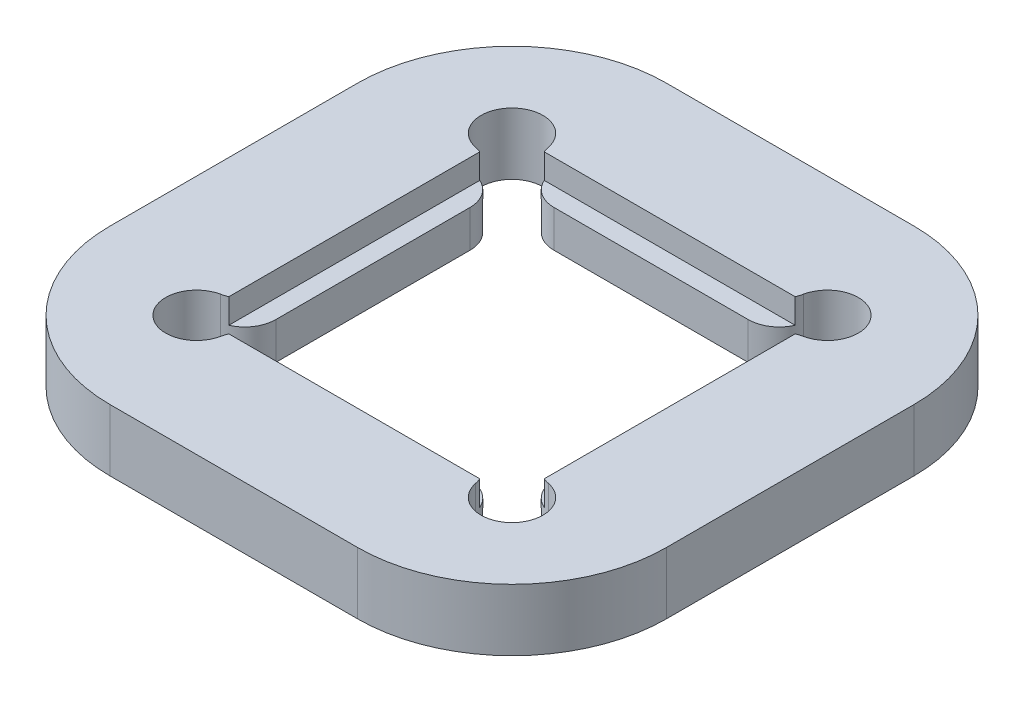
ISO-10303-21;
HEADER;
FILE_DESCRIPTION(('STEP AP214'),'2;1');
FILE_NAME('part.step','',(''),(''),'','','');
FILE_SCHEMA(('AUTOMOTIVE_DESIGN { 1 0 10303 214 1 1 1 1 }'));
ENDSEC;
DATA;
#1=APPLICATION_CONTEXT('core data for automotive mechanical design processes');
#2=APPLICATION_PROTOCOL_DEFINITION('international standard','automotive_design',2000,#1);
#3=PRODUCT_CONTEXT('',#1,'mechanical');
#4=PRODUCT('Part','Part','',(#3));
#5=PRODUCT_RELATED_PRODUCT_CATEGORY('part','',(#4));
#6=PRODUCT_DEFINITION_FORMATION('','',#4);
#7=PRODUCT_DEFINITION_CONTEXT('part definition',#1,'design');
#8=PRODUCT_DEFINITION('design','',#6,#7);
#9=PRODUCT_DEFINITION_SHAPE('','',#8);
#10=(LENGTH_UNIT() NAMED_UNIT(*) SI_UNIT(.MILLI.,.METRE.));
#11=(NAMED_UNIT(*) PLANE_ANGLE_UNIT() SI_UNIT($,.RADIAN.));
#12=(NAMED_UNIT(*) SI_UNIT($,.STERADIAN.) SOLID_ANGLE_UNIT());
#13=UNCERTAINTY_MEASURE_WITH_UNIT(LENGTH_MEASURE(1.E-05),#10,'distance_accuracy_value','');
#14=(GEOMETRIC_REPRESENTATION_CONTEXT(3) GLOBAL_UNCERTAINTY_ASSIGNED_CONTEXT((#13)) GLOBAL_UNIT_ASSIGNED_CONTEXT((#10,
#11,#12)) REPRESENTATION_CONTEXT('',''));
#15=CARTESIAN_POINT('',(0.,0.,0.));
#16=DIRECTION('',(0.,0.,1.));
#17=DIRECTION('',(1.,0.,0.));
#18=AXIS2_PLACEMENT_3D('',#15,#16,#17);
#19=CARTESIAN_POINT('',(0.,6.,0.));
#20=DIRECTION('',(0.,1.,0.));
#21=DIRECTION('',(0.,0.,1.));
#22=AXIS2_PLACEMENT_3D('',#19,#20,#21);
#23=PLANE('',#22);
#24=DIRECTION('',(-1.,0.,0.));
#25=VECTOR('',#24,1.);
#26=CARTESIAN_POINT('',(19.5,6.,-70.5));
#27=LINE('',#26,#25);
#28=CARTESIAN_POINT('',(65.2846167238231,6.,-70.5));
#29=VERTEX_POINT('',#28);
#30=CARTESIAN_POINT('',(24.7153832761769,6.,-70.5));
#31=VERTEX_POINT('',#30);
#32=EDGE_CURVE('E419',#29,#31,#27,.T.);
#33=ORIENTED_EDGE('',*,*,#32,.T.);
#34=CARTESIAN_POINT('',(29.2979589711327,6.,-72.5));
#35=DIRECTION('',(0.,1.,0.));
#36=DIRECTION('',(0.,0.,1.));
#37=AXIS2_PLACEMENT_3D('',#34,#35,#36);
#38=CIRCLE('',#37,5.);
#39=CARTESIAN_POINT('',(29.2979589711327,6.,-67.5));
#40=VERTEX_POINT('',#39);
#41=EDGE_CURVE('E319',#31,#40,#38,.T.);
#42=ORIENTED_EDGE('',*,*,#41,.T.);
#43=DIRECTION('',(-1.,0.,0.));
#44=VECTOR('',#43,1.);
#45=CARTESIAN_POINT('',(22.5,6.,-67.5));
#46=LINE('',#45,#44);
#47=CARTESIAN_POINT('',(60.7020410288673,6.,-67.5));
#48=VERTEX_POINT('',#47);
#49=EDGE_CURVE('E532',#48,#40,#46,.T.);
#50=ORIENTED_EDGE('',*,*,#49,.F.);
#51=CARTESIAN_POINT('',(60.7020410288673,6.,-72.5));
#52=DIRECTION('',(0.,1.,0.));
#53=DIRECTION('',(0.,0.,1.));
#54=AXIS2_PLACEMENT_3D('',#51,#52,#53);
#55=CIRCLE('',#54,5.);
#56=EDGE_CURVE('E271',#48,#29,#55,.T.);
#57=ORIENTED_EDGE('',*,*,#56,.T.);
#58=EDGE_LOOP('',(#33,#42,#50,#57));
#59=FACE_BOUND('',#58,.T.);
#60=ADVANCED_FACE('F33',(#59),#23,.T.);
#61=DIRECTION('',(1.,0.,0.));
#62=VECTOR('',#61,1.);
#63=CARTESIAN_POINT('',(22.5,6.,-22.5));
#64=LINE('',#63,#62);
#65=CARTESIAN_POINT('',(29.2979589711327,6.,-22.5));
#66=VERTEX_POINT('',#65);
#67=CARTESIAN_POINT('',(60.7020410288673,6.,-22.5));
#68=VERTEX_POINT('',#67);
#69=EDGE_CURVE('E527',#66,#68,#64,.T.);
#70=ORIENTED_EDGE('',*,*,#69,.F.);
#71=CARTESIAN_POINT('',(29.2979589711327,6.,-17.5));
#72=DIRECTION('',(0.,1.,0.));
#73=DIRECTION('',(0.,0.,1.));
#74=AXIS2_PLACEMENT_3D('',#71,#72,#73);
#75=CIRCLE('',#74,5.);
#76=CARTESIAN_POINT('',(24.7153832761769,6.,-19.5));
#77=VERTEX_POINT('',#76);
#78=EDGE_CURVE('E365',#66,#77,#75,.T.);
#79=ORIENTED_EDGE('',*,*,#78,.T.);
#80=DIRECTION('',(1.,0.,0.));
#81=VECTOR('',#80,1.);
#82=CARTESIAN_POINT('',(19.5,6.,-19.5));
#83=LINE('',#82,#81);
#84=CARTESIAN_POINT('',(65.2846167238231,6.,-19.5));
#85=VERTEX_POINT('',#84);
#86=EDGE_CURVE('E501',#77,#85,#83,.T.);
#87=ORIENTED_EDGE('',*,*,#86,.T.);
#88=CARTESIAN_POINT('',(60.7020410288673,6.,-17.5));
#89=DIRECTION('',(0.,1.,0.));
#90=DIRECTION('',(0.,0.,1.));
#91=AXIS2_PLACEMENT_3D('',#88,#89,#90);
#92=CIRCLE('',#91,5.);
#93=EDGE_CURVE('E363',#85,#68,#92,.T.);
#94=ORIENTED_EDGE('',*,*,#93,.T.);
#95=EDGE_LOOP('',(#70,#79,#87,#94));
#96=FACE_BOUND('',#95,.T.);
#97=ADVANCED_FACE('F464',(#96),#23,.T.);
#98=DIRECTION('',(0.,0.,-1.));
#99=VECTOR('',#98,1.);
#100=CARTESIAN_POINT('',(70.5,6.,-70.5));
#101=LINE('',#100,#99);
#102=CARTESIAN_POINT('',(70.5,6.,-24.7153832761769));
#103=VERTEX_POINT('',#102);
#104=CARTESIAN_POINT('',(70.5,6.,-65.2846167238231));
#105=VERTEX_POINT('',#104);
#106=EDGE_CURVE('E424',#103,#105,#101,.T.);
#107=ORIENTED_EDGE('',*,*,#106,.T.);
#108=CARTESIAN_POINT('',(72.5,6.,-60.7020410288673));
#109=DIRECTION('',(0.,1.,0.));
#110=DIRECTION('',(0.,0.,1.));
#111=AXIS2_PLACEMENT_3D('',#108,#109,#110);
#112=CIRCLE('',#111,5.);
#113=CARTESIAN_POINT('',(67.5,6.,-60.7020410288673));
#114=VERTEX_POINT('',#113);
#115=EDGE_CURVE('E351',#105,#114,#112,.T.);
#116=ORIENTED_EDGE('',*,*,#115,.T.);
#117=DIRECTION('',(0.,0.,-1.));
#118=VECTOR('',#117,1.);
#119=CARTESIAN_POINT('',(67.5,6.,-67.5));
#120=LINE('',#119,#118);
#121=CARTESIAN_POINT('',(67.5,6.,-29.2979589711327));
#122=VERTEX_POINT('',#121);
#123=EDGE_CURVE('E514',#122,#114,#120,.T.);
#124=ORIENTED_EDGE('',*,*,#123,.F.);
#125=CARTESIAN_POINT('',(72.5,6.,-29.2979589711327));
#126=DIRECTION('',(0.,1.,0.));
#127=DIRECTION('',(0.,0.,1.));
#128=AXIS2_PLACEMENT_3D('',#125,#126,#127);
#129=CIRCLE('',#128,5.);
#130=EDGE_CURVE('E349',#122,#103,#129,.T.);
#131=ORIENTED_EDGE('',*,*,#130,.T.);
#132=EDGE_LOOP('',(#107,#116,#124,#131));
#133=FACE_BOUND('',#132,.T.);
#134=ADVANCED_FACE('F471',(#133),#23,.T.);
#135=CARTESIAN_POINT('',(0.,10.,0.));
#136=DIRECTION('',(1.,0.,0.));
#137=DIRECTION('',(0.,0.,-1.));
#138=AXIS2_PLACEMENT_3D('',#135,#136,#137);
#139=PLANE('',#138);
#140=DIRECTION('',(0.,0.,1.));
#141=VECTOR('',#140,1.);
#142=CARTESIAN_POINT('',(0.,0.,0.));
#143=LINE('',#142,#141);
#144=CARTESIAN_POINT('',(0.,0.,-65.));
#145=VERTEX_POINT('',#144);
#146=CARTESIAN_POINT('',(0.,0.,-25.));
#147=VERTEX_POINT('',#146);
#148=EDGE_CURVE('E410',#145,#147,#143,.T.);
#149=ORIENTED_EDGE('',*,*,#148,.T.);
#150=DIRECTION('',(0.,-1.,0.));
#151=VECTOR('',#150,1.);
#152=CARTESIAN_POINT('',(0.,10.,-25.));
#153=LINE('',#152,#151);
#154=CARTESIAN_POINT('',(0.,10.,-25.));
#155=VERTEX_POINT('',#154);
#156=EDGE_CURVE('E11',#147,#155,#153,.F.);
#157=ORIENTED_EDGE('',*,*,#156,.T.);
#158=DIRECTION('',(0.,0.,1.));
#159=VECTOR('',#158,1.);
#160=CARTESIAN_POINT('',(0.,10.,0.));
#161=LINE('',#160,#159);
#162=CARTESIAN_POINT('',(0.,10.,-65.));
#163=VERTEX_POINT('',#162);
#164=EDGE_CURVE('E412',#163,#155,#161,.T.);
#165=ORIENTED_EDGE('',*,*,#164,.F.);
#166=DIRECTION('',(0.,-1.,0.));
#167=VECTOR('',#166,1.);
#168=CARTESIAN_POINT('',(0.,10.,-65.));
#169=LINE('',#168,#167);
#170=EDGE_CURVE('E41',#163,#145,#169,.T.);
#171=ORIENTED_EDGE('',*,*,#170,.T.);
#172=EDGE_LOOP('',(#149,#157,#165,#171));
#173=FACE_BOUND('',#172,.T.);
#174=ADVANCED_FACE('F409',(#173),#139,.F.);
#175=CARTESIAN_POINT('',(0.,10.,0.));
#176=DIRECTION('',(0.,0.,-1.));
#177=DIRECTION('',(-1.,0.,0.));
#178=AXIS2_PLACEMENT_3D('',#175,#176,#177);
#179=PLANE('',#178);
#180=DIRECTION('',(1.,0.,0.));
#181=VECTOR('',#180,1.);
#182=CARTESIAN_POINT('',(0.,0.,0.));
#183=LINE('',#182,#181);
#184=CARTESIAN_POINT('',(25.,0.,0.));
#185=VERTEX_POINT('',#184);
#186=CARTESIAN_POINT('',(65.,0.,0.));
#187=VERTEX_POINT('',#186);
#188=EDGE_CURVE('E418',#185,#187,#183,.T.);
#189=ORIENTED_EDGE('',*,*,#188,.T.);
#190=DIRECTION('',(0.,-1.,0.));
#191=VECTOR('',#190,1.);
#192=CARTESIAN_POINT('',(65.,10.,0.));
#193=LINE('',#192,#191);
#194=CARTESIAN_POINT('',(65.,10.,0.));
#195=VERTEX_POINT('',#194);
#196=EDGE_CURVE('E48',#187,#195,#193,.F.);
#197=ORIENTED_EDGE('',*,*,#196,.T.);
#198=DIRECTION('',(1.,0.,0.));
#199=VECTOR('',#198,1.);
#200=CARTESIAN_POINT('',(0.,10.,0.));
#201=LINE('',#200,#199);
#202=CARTESIAN_POINT('',(25.,10.,0.));
#203=VERTEX_POINT('',#202);
#204=EDGE_CURVE('E433',#203,#195,#201,.T.);
#205=ORIENTED_EDGE('',*,*,#204,.F.);
#206=DIRECTION('',(0.,-1.,0.));
#207=VECTOR('',#206,1.);
#208=CARTESIAN_POINT('',(25.,10.,0.));
#209=LINE('',#208,#207);
#210=EDGE_CURVE('E400',#203,#185,#209,.T.);
#211=ORIENTED_EDGE('',*,*,#210,.T.);
#212=EDGE_LOOP('',(#189,#197,#205,#211));
#213=FACE_BOUND('',#212,.T.);
#214=ADVANCED_FACE('F451',(#213),#179,.F.);
#215=CARTESIAN_POINT('',(90.,10.,0.));
#216=DIRECTION('',(-1.,0.,0.));
#217=DIRECTION('',(0.,0.,1.));
#218=AXIS2_PLACEMENT_3D('',#215,#216,#217);
#219=PLANE('',#218);
#220=DIRECTION('',(0.,0.,-1.));
#221=VECTOR('',#220,1.);
#222=CARTESIAN_POINT('',(90.,0.,0.));
#223=LINE('',#222,#221);
#224=CARTESIAN_POINT('',(90.,0.,-25.));
#225=VERTEX_POINT('',#224);
#226=CARTESIAN_POINT('',(90.,0.,-65.));
#227=VERTEX_POINT('',#226);
#228=EDGE_CURVE('E421',#225,#227,#223,.T.);
#229=ORIENTED_EDGE('',*,*,#228,.T.);
#230=DIRECTION('',(0.,-1.,0.));
#231=VECTOR('',#230,1.);
#232=CARTESIAN_POINT('',(90.,10.,-65.));
#233=LINE('',#232,#231);
#234=CARTESIAN_POINT('',(90.,10.,-65.));
#235=VERTEX_POINT('',#234);
#236=EDGE_CURVE('E391',#227,#235,#233,.F.);
#237=ORIENTED_EDGE('',*,*,#236,.T.);
#238=DIRECTION('',(0.,0.,-1.));
#239=VECTOR('',#238,1.);
#240=CARTESIAN_POINT('',(90.,10.,0.));
#241=LINE('',#240,#239);
#242=CARTESIAN_POINT('',(90.,10.,-25.));
#243=VERTEX_POINT('',#242);
#244=EDGE_CURVE('E277',#243,#235,#241,.T.);
#245=ORIENTED_EDGE('',*,*,#244,.F.);
#246=DIRECTION('',(0.,-1.,0.));
#247=VECTOR('',#246,1.);
#248=CARTESIAN_POINT('',(90.,10.,-25.));
#249=LINE('',#248,#247);
#250=EDGE_CURVE('E388',#243,#225,#249,.T.);
#251=ORIENTED_EDGE('',*,*,#250,.T.);
#252=EDGE_LOOP('',(#229,#237,#245,#251));
#253=FACE_BOUND('',#252,.T.);
#254=ADVANCED_FACE('F454',(#253),#219,.F.);
#255=CARTESIAN_POINT('',(0.,10.,-90.));
#256=DIRECTION('',(0.,0.,1.));
#257=DIRECTION('',(1.,0.,0.));
#258=AXIS2_PLACEMENT_3D('',#255,#256,#257);
#259=PLANE('',#258);
#260=DIRECTION('',(-1.,0.,0.));
#261=VECTOR('',#260,1.);
#262=CARTESIAN_POINT('',(0.,10.,-90.));
#263=LINE('',#262,#261);
#264=CARTESIAN_POINT('',(65.,10.,-90.));
#265=VERTEX_POINT('',#264);
#266=CARTESIAN_POINT('',(25.,10.,-90.));
#267=VERTEX_POINT('',#266);
#268=EDGE_CURVE('E272',#265,#267,#263,.T.);
#269=ORIENTED_EDGE('',*,*,#268,.F.);
#270=DIRECTION('',(0.,-1.,0.));
#271=VECTOR('',#270,1.);
#272=CARTESIAN_POINT('',(65.,10.,-90.));
#273=LINE('',#272,#271);
#274=CARTESIAN_POINT('',(65.,0.,-90.));
#275=VERTEX_POINT('',#274);
#276=EDGE_CURVE('E377',#265,#275,#273,.T.);
#277=ORIENTED_EDGE('',*,*,#276,.T.);
#278=DIRECTION('',(-1.,0.,0.));
#279=VECTOR('',#278,1.);
#280=CARTESIAN_POINT('',(0.,0.,-90.));
#281=LINE('',#280,#279);
#282=CARTESIAN_POINT('',(25.,0.,-90.));
#283=VERTEX_POINT('',#282);
#284=EDGE_CURVE('E280',#275,#283,#281,.T.);
#285=ORIENTED_EDGE('',*,*,#284,.T.);
#286=DIRECTION('',(0.,-1.,0.));
#287=VECTOR('',#286,1.);
#288=CARTESIAN_POINT('',(25.,10.,-90.));
#289=LINE('',#288,#287);
#290=EDGE_CURVE('E375',#283,#267,#289,.F.);
#291=ORIENTED_EDGE('',*,*,#290,.T.);
#292=EDGE_LOOP('',(#269,#277,#285,#291));
#293=FACE_BOUND('',#292,.T.);
#294=ADVANCED_FACE('F449',(#293),#259,.F.);
#295=CARTESIAN_POINT('',(0.,10.,0.));
#296=DIRECTION('',(0.,-1.,0.));
#297=DIRECTION('',(0.,0.,-1.));
#298=AXIS2_PLACEMENT_3D('',#295,#296,#297);
#299=PLANE('',#298);
#300=CARTESIAN_POINT('',(19.5,10.,-70.5));
#301=DIRECTION('',(0.,1.,0.));
#302=DIRECTION('',(0.,0.,1.));
#303=AXIS2_PLACEMENT_3D('',#300,#301,#302);
#304=CIRCLE('',#303,5.);
#305=CARTESIAN_POINT('',(24.3989794855664,10.,-71.5));
#306=VERTEX_POINT('',#305);
#307=CARTESIAN_POINT('',(18.5,10.,-65.6010205144336));
#308=VERTEX_POINT('',#307);
#309=EDGE_CURVE('E567',#306,#308,#304,.T.);
#310=ORIENTED_EDGE('',*,*,#309,.F.);
#311=CARTESIAN_POINT('',(29.2979589711327,10.,-72.5));
#312=DIRECTION('',(0.,-1.,0.));
#313=DIRECTION('',(0.,0.,-1.));
#314=AXIS2_PLACEMENT_3D('',#311,#312,#313);
#315=CIRCLE('',#314,5.);
#316=CARTESIAN_POINT('',(24.7153832761769,10.,-70.5));
#317=VERTEX_POINT('',#316);
#318=EDGE_CURVE('E312',#306,#317,#315,.F.);
#319=ORIENTED_EDGE('',*,*,#318,.T.);
#320=DIRECTION('',(-1.,0.,0.));
#321=VECTOR('',#320,1.);
#322=CARTESIAN_POINT('',(19.5,10.,-70.5));
#323=LINE('',#322,#321);
#324=CARTESIAN_POINT('',(65.2846167238231,10.,-70.5));
#325=VERTEX_POINT('',#324);
#326=EDGE_CURVE('E437',#325,#317,#323,.T.);
#327=ORIENTED_EDGE('',*,*,#326,.F.);
#328=CARTESIAN_POINT('',(60.7020410288673,10.,-72.5));
#329=DIRECTION('',(0.,-1.,0.));
#330=DIRECTION('',(0.,0.,-1.));
#331=AXIS2_PLACEMENT_3D('',#328,#329,#330);
#332=CIRCLE('',#331,5.);
#333=CARTESIAN_POINT('',(65.6010205144336,10.,-71.5));
#334=VERTEX_POINT('',#333);
#335=EDGE_CURVE('E306',#325,#334,#332,.F.);
#336=ORIENTED_EDGE('',*,*,#335,.T.);
#337=CARTESIAN_POINT('',(70.5,10.,-70.5));
#338=DIRECTION('',(0.,1.,0.));
#339=DIRECTION('',(0.,0.,1.));
#340=AXIS2_PLACEMENT_3D('',#337,#338,#339);
#341=CIRCLE('',#340,5.00000000000001);
#342=CARTESIAN_POINT('',(71.5,10.,-65.6010205144336));
#343=VERTEX_POINT('',#342);
#344=EDGE_CURVE('E562',#343,#334,#341,.T.);
#345=ORIENTED_EDGE('',*,*,#344,.F.);
#346=CARTESIAN_POINT('',(72.5,10.,-60.7020410288673));
#347=DIRECTION('',(0.,-1.,0.));
#348=DIRECTION('',(0.,0.,-1.));
#349=AXIS2_PLACEMENT_3D('',#346,#347,#348);
#350=CIRCLE('',#349,5.);
#351=CARTESIAN_POINT('',(70.5,10.,-65.2846167238231));
#352=VERTEX_POINT('',#351);
#353=EDGE_CURVE('E308',#343,#352,#350,.F.);
#354=ORIENTED_EDGE('',*,*,#353,.T.);
#355=DIRECTION('',(0.,0.,-1.));
#356=VECTOR('',#355,1.);
#357=CARTESIAN_POINT('',(70.5,10.,-70.5));
#358=LINE('',#357,#356);
#359=CARTESIAN_POINT('',(70.5,10.,-24.7153832761769));
#360=VERTEX_POINT('',#359);
#361=EDGE_CURVE('E543',#360,#352,#358,.T.);
#362=ORIENTED_EDGE('',*,*,#361,.F.);
#363=CARTESIAN_POINT('',(72.5,10.,-29.2979589711327));
#364=DIRECTION('',(0.,-1.,0.));
#365=DIRECTION('',(0.,0.,-1.));
#366=AXIS2_PLACEMENT_3D('',#363,#364,#365);
#367=CIRCLE('',#366,5.);
#368=CARTESIAN_POINT('',(71.5,10.,-24.3989794855664));
#369=VERTEX_POINT('',#368);
#370=EDGE_CURVE('E298',#360,#369,#367,.F.);
#371=ORIENTED_EDGE('',*,*,#370,.T.);
#372=CARTESIAN_POINT('',(70.5,10.,-19.5));
#373=DIRECTION('',(0.,1.,0.));
#374=DIRECTION('',(0.,0.,1.));
#375=AXIS2_PLACEMENT_3D('',#372,#373,#374);
#376=CIRCLE('',#375,5.);
#377=CARTESIAN_POINT('',(65.6010205144336,10.,-18.5));
#378=VERTEX_POINT('',#377);
#379=EDGE_CURVE('E630',#378,#369,#376,.T.);
#380=ORIENTED_EDGE('',*,*,#379,.F.);
#381=CARTESIAN_POINT('',(60.7020410288673,10.,-17.5));
#382=DIRECTION('',(0.,-1.,0.));
#383=DIRECTION('',(0.,0.,-1.));
#384=AXIS2_PLACEMENT_3D('',#381,#382,#383);
#385=CIRCLE('',#384,5.);
#386=CARTESIAN_POINT('',(65.2846167238231,10.,-19.5));
#387=VERTEX_POINT('',#386);
#388=EDGE_CURVE('E300',#378,#387,#385,.F.);
#389=ORIENTED_EDGE('',*,*,#388,.T.);
#390=DIRECTION('',(1.,0.,0.));
#391=VECTOR('',#390,1.);
#392=CARTESIAN_POINT('',(19.5,10.,-19.5));
#393=LINE('',#392,#391);
#394=CARTESIAN_POINT('',(24.7153832761769,10.,-19.5));
#395=VERTEX_POINT('',#394);
#396=EDGE_CURVE('E541',#395,#387,#393,.T.);
#397=ORIENTED_EDGE('',*,*,#396,.F.);
#398=CARTESIAN_POINT('',(29.2979589711327,10.,-17.5));
#399=DIRECTION('',(0.,-1.,0.));
#400=DIRECTION('',(0.,0.,-1.));
#401=AXIS2_PLACEMENT_3D('',#398,#399,#400);
#402=CIRCLE('',#401,5.);
#403=CARTESIAN_POINT('',(24.3989794855664,10.,-18.5));
#404=VERTEX_POINT('',#403);
#405=EDGE_CURVE('E302',#395,#404,#402,.F.);
#406=ORIENTED_EDGE('',*,*,#405,.T.);
#407=CARTESIAN_POINT('',(19.5,10.,-19.5));
#408=DIRECTION('',(0.,1.,0.));
#409=DIRECTION('',(0.,0.,1.));
#410=AXIS2_PLACEMENT_3D('',#407,#408,#409);
#411=CIRCLE('',#410,5.);
#412=CARTESIAN_POINT('',(18.5,10.,-24.3989794855664));
#413=VERTEX_POINT('',#412);
#414=EDGE_CURVE('E570',#413,#404,#411,.T.);
#415=ORIENTED_EDGE('',*,*,#414,.F.);
#416=CARTESIAN_POINT('',(17.5,10.,-29.2979589711327));
#417=DIRECTION('',(0.,-1.,0.));
#418=DIRECTION('',(0.,0.,-1.));
#419=AXIS2_PLACEMENT_3D('',#416,#417,#418);
#420=CIRCLE('',#419,5.);
#421=CARTESIAN_POINT('',(19.5,10.,-24.7153832761769));
#422=VERTEX_POINT('',#421);
#423=EDGE_CURVE('E304',#413,#422,#420,.F.);
#424=ORIENTED_EDGE('',*,*,#423,.T.);
#425=DIRECTION('',(0.,0.,1.));
#426=VECTOR('',#425,1.);
#427=CARTESIAN_POINT('',(19.5,10.,-70.5));
#428=LINE('',#427,#426);
#429=CARTESIAN_POINT('',(19.5,10.,-65.2846167238231));
#430=VERTEX_POINT('',#429);
#431=EDGE_CURVE('E266',#430,#422,#428,.T.);
#432=ORIENTED_EDGE('',*,*,#431,.F.);
#433=CARTESIAN_POINT('',(17.5,10.,-60.7020410288673));
#434=DIRECTION('',(0.,-1.,0.));
#435=DIRECTION('',(0.,0.,-1.));
#436=AXIS2_PLACEMENT_3D('',#433,#434,#435);
#437=CIRCLE('',#436,5.);
#438=EDGE_CURVE('E310',#430,#308,#437,.F.);
#439=ORIENTED_EDGE('',*,*,#438,.T.);
#440=EDGE_LOOP('',(#310,#319,#327,#336,#345,#354,#362,#371,#380,#389,#397,#406,#415,#424,#432,#439));
#441=FACE_BOUND('',#440,.T.);
#442=ORIENTED_EDGE('',*,*,#244,.T.);
#443=CARTESIAN_POINT('',(65.,10.,-65.));
#444=DIRECTION('',(0.,-1.,0.));
#445=DIRECTION('',(0.,0.,-1.));
#446=AXIS2_PLACEMENT_3D('',#443,#444,#445);
#447=CIRCLE('',#446,25.);
#448=EDGE_CURVE('E398',#235,#265,#447,.F.);
#449=ORIENTED_EDGE('',*,*,#448,.T.);
#450=ORIENTED_EDGE('',*,*,#268,.T.);
#451=CARTESIAN_POINT('',(25.,10.,-65.));
#452=DIRECTION('',(0.,-1.,0.));
#453=DIRECTION('',(0.,0.,-1.));
#454=AXIS2_PLACEMENT_3D('',#451,#452,#453);
#455=CIRCLE('',#454,25.);
#456=EDGE_CURVE('E393',#267,#163,#455,.F.);
#457=ORIENTED_EDGE('',*,*,#456,.T.);
#458=ORIENTED_EDGE('',*,*,#164,.T.);
#459=CARTESIAN_POINT('',(25.,10.,-25.));
#460=DIRECTION('',(0.,-1.,0.));
#461=DIRECTION('',(0.,0.,-1.));
#462=AXIS2_PLACEMENT_3D('',#459,#460,#461);
#463=CIRCLE('',#462,25.);
#464=EDGE_CURVE('E55',#155,#203,#463,.F.);
#465=ORIENTED_EDGE('',*,*,#464,.T.);
#466=ORIENTED_EDGE('',*,*,#204,.T.);
#467=CARTESIAN_POINT('',(65.,10.,-25.));
#468=DIRECTION('',(0.,-1.,0.));
#469=DIRECTION('',(0.,0.,-1.));
#470=AXIS2_PLACEMENT_3D('',#467,#468,#469);
#471=CIRCLE('',#470,25.);
#472=EDGE_CURVE('E396',#195,#243,#471,.F.);
#473=ORIENTED_EDGE('',*,*,#472,.T.);
#474=EDGE_LOOP('',(#442,#449,#450,#457,#458,#465,#466,#473));
#475=FACE_BOUND('',#474,.T.);
#476=ADVANCED_FACE('F442',(#441,#475),#299,.F.);
#477=CARTESIAN_POINT('',(0.,0.,0.));
#478=DIRECTION('',(0.,-1.,0.));
#479=DIRECTION('',(0.,0.,-1.));
#480=AXIS2_PLACEMENT_3D('',#477,#478,#479);
#481=PLANE('',#480);
#482=DIRECTION('',(-1.,0.,0.));
#483=VECTOR('',#482,1.);
#484=CARTESIAN_POINT('',(22.5,0.,-67.5));
#485=LINE('',#484,#483);
#486=CARTESIAN_POINT('',(60.7020410288673,0.,-67.5));
#487=VERTEX_POINT('',#486);
#488=CARTESIAN_POINT('',(29.2979589711327,0.,-67.5));
#489=VERTEX_POINT('',#488);
#490=EDGE_CURVE('E248',#487,#489,#485,.T.);
#491=ORIENTED_EDGE('',*,*,#490,.T.);
#492=CARTESIAN_POINT('',(29.2979589711327,0.,-72.5));
#493=DIRECTION('',(0.,-1.,0.));
#494=DIRECTION('',(0.,0.,-1.));
#495=AXIS2_PLACEMENT_3D('',#492,#493,#494);
#496=CIRCLE('',#495,5.);
#497=CARTESIAN_POINT('',(24.3989794855664,0.,-71.5));
#498=VERTEX_POINT('',#497);
#499=EDGE_CURVE('E292',#489,#498,#496,.T.);
#500=ORIENTED_EDGE('',*,*,#499,.T.);
#501=CARTESIAN_POINT('',(19.5,0.,-70.5));
#502=DIRECTION('',(0.,1.,0.));
#503=DIRECTION('',(0.,0.,1.));
#504=AXIS2_PLACEMENT_3D('',#501,#502,#503);
#505=CIRCLE('',#504,5.);
#506=CARTESIAN_POINT('',(18.5,0.,-65.6010205144336));
#507=VERTEX_POINT('',#506);
#508=EDGE_CURVE('E528',#498,#507,#505,.T.);
#509=ORIENTED_EDGE('',*,*,#508,.T.);
#510=CARTESIAN_POINT('',(17.5,0.,-60.7020410288673));
#511=DIRECTION('',(0.,-1.,0.));
#512=DIRECTION('',(0.,0.,-1.));
#513=AXIS2_PLACEMENT_3D('',#510,#511,#512);
#514=CIRCLE('',#513,5.);
#515=CARTESIAN_POINT('',(22.5,0.,-60.7020410288673));
#516=VERTEX_POINT('',#515);
#517=EDGE_CURVE('E290',#507,#516,#514,.T.);
#518=ORIENTED_EDGE('',*,*,#517,.T.);
#519=DIRECTION('',(0.,0.,1.));
#520=VECTOR('',#519,1.);
#521=CARTESIAN_POINT('',(22.5,0.,-67.5));
#522=LINE('',#521,#520);
#523=CARTESIAN_POINT('',(22.5,0.,-29.2979589711327));
#524=VERTEX_POINT('',#523);
#525=EDGE_CURVE('E520',#516,#524,#522,.T.);
#526=ORIENTED_EDGE('',*,*,#525,.T.);
#527=CARTESIAN_POINT('',(17.5,0.,-29.2979589711327));
#528=DIRECTION('',(0.,-1.,0.));
#529=DIRECTION('',(0.,0.,-1.));
#530=AXIS2_PLACEMENT_3D('',#527,#528,#529);
#531=CIRCLE('',#530,5.);
#532=CARTESIAN_POINT('',(18.5,0.,-24.3989794855664));
#533=VERTEX_POINT('',#532);
#534=EDGE_CURVE('E255',#524,#533,#531,.T.);
#535=ORIENTED_EDGE('',*,*,#534,.T.);
#536=CARTESIAN_POINT('',(19.5,0.,-19.5));
#537=DIRECTION('',(0.,1.,0.));
#538=DIRECTION('',(0.,0.,1.));
#539=AXIS2_PLACEMENT_3D('',#536,#537,#538);
#540=CIRCLE('',#539,5.);
#541=CARTESIAN_POINT('',(24.3989794855664,0.,-18.5));
#542=VERTEX_POINT('',#541);
#543=EDGE_CURVE('E565',#533,#542,#540,.T.);
#544=ORIENTED_EDGE('',*,*,#543,.T.);
#545=CARTESIAN_POINT('',(29.2979589711327,0.,-17.5));
#546=DIRECTION('',(0.,-1.,0.));
#547=DIRECTION('',(0.,0.,-1.));
#548=AXIS2_PLACEMENT_3D('',#545,#546,#547);
#549=CIRCLE('',#548,5.);
#550=CARTESIAN_POINT('',(29.2979589711327,0.,-22.5));
#551=VERTEX_POINT('',#550);
#552=EDGE_CURVE('E286',#542,#551,#549,.T.);
#553=ORIENTED_EDGE('',*,*,#552,.T.);
#554=DIRECTION('',(1.,0.,0.));
#555=VECTOR('',#554,1.);
#556=CARTESIAN_POINT('',(22.5,0.,-22.5));
#557=LINE('',#556,#555);
#558=CARTESIAN_POINT('',(60.7020410288673,0.,-22.5));
#559=VERTEX_POINT('',#558);
#560=EDGE_CURVE('E517',#551,#559,#557,.T.);
#561=ORIENTED_EDGE('',*,*,#560,.T.);
#562=CARTESIAN_POINT('',(60.7020410288673,0.,-17.5));
#563=DIRECTION('',(0.,-1.,0.));
#564=DIRECTION('',(0.,0.,-1.));
#565=AXIS2_PLACEMENT_3D('',#562,#563,#564);
#566=CIRCLE('',#565,5.);
#567=CARTESIAN_POINT('',(65.6010205144336,0.,-18.5));
#568=VERTEX_POINT('',#567);
#569=EDGE_CURVE('E284',#559,#568,#566,.T.);
#570=ORIENTED_EDGE('',*,*,#569,.T.);
#571=CARTESIAN_POINT('',(70.5,0.,-19.5));
#572=DIRECTION('',(0.,1.,0.));
#573=DIRECTION('',(0.,0.,1.));
#574=AXIS2_PLACEMENT_3D('',#571,#572,#573);
#575=CIRCLE('',#574,5.);
#576=CARTESIAN_POINT('',(71.5,0.,-24.3989794855664));
#577=VERTEX_POINT('',#576);
#578=EDGE_CURVE('E576',#568,#577,#575,.T.);
#579=ORIENTED_EDGE('',*,*,#578,.T.);
#580=CARTESIAN_POINT('',(72.5,0.,-29.2979589711327));
#581=DIRECTION('',(0.,-1.,0.));
#582=DIRECTION('',(0.,0.,-1.));
#583=AXIS2_PLACEMENT_3D('',#580,#581,#582);
#584=CIRCLE('',#583,5.);
#585=CARTESIAN_POINT('',(67.5,0.,-29.2979589711327));
#586=VERTEX_POINT('',#585);
#587=EDGE_CURVE('E274',#577,#586,#584,.T.);
#588=ORIENTED_EDGE('',*,*,#587,.T.);
#589=DIRECTION('',(0.,0.,-1.));
#590=VECTOR('',#589,1.);
#591=CARTESIAN_POINT('',(67.5,0.,-67.5));
#592=LINE('',#591,#590);
#593=CARTESIAN_POINT('',(67.5,0.,-60.7020410288673));
#594=VERTEX_POINT('',#593);
#595=EDGE_CURVE('E267',#586,#594,#592,.T.);
#596=ORIENTED_EDGE('',*,*,#595,.T.);
#597=CARTESIAN_POINT('',(72.5,0.,-60.7020410288673));
#598=DIRECTION('',(0.,-1.,0.));
#599=DIRECTION('',(0.,0.,-1.));
#600=AXIS2_PLACEMENT_3D('',#597,#598,#599);
#601=CIRCLE('',#600,5.);
#602=CARTESIAN_POINT('',(71.5,0.,-65.6010205144336));
#603=VERTEX_POINT('',#602);
#604=EDGE_CURVE('E254',#594,#603,#601,.T.);
#605=ORIENTED_EDGE('',*,*,#604,.T.);
#606=CARTESIAN_POINT('',(70.5,0.,-70.5));
#607=DIRECTION('',(0.,1.,0.));
#608=DIRECTION('',(0.,0.,1.));
#609=AXIS2_PLACEMENT_3D('',#606,#607,#608);
#610=CIRCLE('',#609,5.00000000000001);
#611=CARTESIAN_POINT('',(65.6010205144336,0.,-71.5));
#612=VERTEX_POINT('',#611);
#613=EDGE_CURVE('E250',#603,#612,#610,.T.);
#614=ORIENTED_EDGE('',*,*,#613,.T.);
#615=CARTESIAN_POINT('',(60.7020410288673,0.,-72.5));
#616=DIRECTION('',(0.,-1.,0.));
#617=DIRECTION('',(0.,0.,-1.));
#618=AXIS2_PLACEMENT_3D('',#615,#616,#617);
#619=CIRCLE('',#618,5.);
#620=EDGE_CURVE('E244',#612,#487,#619,.T.);
#621=ORIENTED_EDGE('',*,*,#620,.T.);
#622=EDGE_LOOP('',(#491,#500,#509,#518,#526,#535,#544,#553,#561,#570,#579,#588,#596,#605,#614,#621));
#623=FACE_BOUND('',#622,.T.);
#624=ORIENTED_EDGE('',*,*,#284,.F.);
#625=CARTESIAN_POINT('',(65.,0.,-65.));
#626=DIRECTION('',(0.,-1.,0.));
#627=DIRECTION('',(0.,0.,-1.));
#628=AXIS2_PLACEMENT_3D('',#625,#626,#627);
#629=CIRCLE('',#628,25.);
#630=EDGE_CURVE('E386',#275,#227,#629,.T.);
#631=ORIENTED_EDGE('',*,*,#630,.T.);
#632=ORIENTED_EDGE('',*,*,#228,.F.);
#633=CARTESIAN_POINT('',(65.,0.,-25.));
#634=DIRECTION('',(0.,-1.,0.));
#635=DIRECTION('',(0.,0.,-1.));
#636=AXIS2_PLACEMENT_3D('',#633,#634,#635);
#637=CIRCLE('',#636,25.);
#638=EDGE_CURVE('E384',#225,#187,#637,.T.);
#639=ORIENTED_EDGE('',*,*,#638,.T.);
#640=ORIENTED_EDGE('',*,*,#188,.F.);
#641=CARTESIAN_POINT('',(25.,0.,-25.));
#642=DIRECTION('',(0.,-1.,0.));
#643=DIRECTION('',(0.,0.,-1.));
#644=AXIS2_PLACEMENT_3D('',#641,#642,#643);
#645=CIRCLE('',#644,25.);
#646=EDGE_CURVE('E382',#185,#147,#645,.T.);
#647=ORIENTED_EDGE('',*,*,#646,.T.);
#648=ORIENTED_EDGE('',*,*,#148,.F.);
#649=CARTESIAN_POINT('',(25.,0.,-65.));
#650=DIRECTION('',(0.,-1.,0.));
#651=DIRECTION('',(0.,0.,-1.));
#652=AXIS2_PLACEMENT_3D('',#649,#650,#651);
#653=CIRCLE('',#652,25.);
#654=EDGE_CURVE('E380',#145,#283,#653,.T.);
#655=ORIENTED_EDGE('',*,*,#654,.T.);
#656=EDGE_LOOP('',(#624,#631,#632,#639,#640,#647,#648,#655));
#657=FACE_BOUND('',#656,.T.);
#658=ADVANCED_FACE('F246',(#623,#657),#481,.T.);
#659=CARTESIAN_POINT('',(19.5,6.,-70.5));
#660=DIRECTION('',(-1.,0.,0.));
#661=DIRECTION('',(0.,0.,1.));
#662=AXIS2_PLACEMENT_3D('',#659,#660,#661);
#663=PLANE('',#662);
#664=DIRECTION('',(0.,0.,1.));
#665=VECTOR('',#664,1.);
#666=CARTESIAN_POINT('',(19.5,6.,-70.5));
#667=LINE('',#666,#665);
#668=CARTESIAN_POINT('',(19.5,6.,-65.2846167238231));
#669=VERTEX_POINT('',#668);
#670=CARTESIAN_POINT('',(19.5,6.,-24.7153832761769));
#671=VERTEX_POINT('',#670);
#672=EDGE_CURVE('E534',#669,#671,#667,.T.);
#673=ORIENTED_EDGE('',*,*,#672,.F.);
#674=DIRECTION('',(0.,1.,0.));
#675=VECTOR('',#674,1.);
#676=CARTESIAN_POINT('',(19.5,6.,-65.2846167238231));
#677=LINE('',#676,#675);
#678=EDGE_CURVE('E333',#669,#430,#677,.T.);
#679=ORIENTED_EDGE('',*,*,#678,.T.);
#680=ORIENTED_EDGE('',*,*,#431,.T.);
#681=DIRECTION('',(0.,1.,0.));
#682=VECTOR('',#681,1.);
#683=CARTESIAN_POINT('',(19.5,10.,-24.7153832761769));
#684=LINE('',#683,#682);
#685=EDGE_CURVE('E331',#422,#671,#684,.F.);
#686=ORIENTED_EDGE('',*,*,#685,.T.);
#687=EDGE_LOOP('',(#673,#679,#680,#686));
#688=FACE_BOUND('',#687,.T.);
#689=ADVANCED_FACE('F594',(#688),#663,.F.);
#690=CARTESIAN_POINT('',(19.5,6.,-70.5));
#691=DIRECTION('',(0.,0.,-1.));
#692=DIRECTION('',(-1.,0.,0.));
#693=AXIS2_PLACEMENT_3D('',#690,#691,#692);
#694=PLANE('',#693);
#695=ORIENTED_EDGE('',*,*,#326,.T.);
#696=DIRECTION('',(0.,1.,0.));
#697=VECTOR('',#696,1.);
#698=CARTESIAN_POINT('',(24.7153832761769,10.,-70.5));
#699=LINE('',#698,#697);
#700=EDGE_CURVE('E316',#317,#31,#699,.F.);
#701=ORIENTED_EDGE('',*,*,#700,.T.);
#702=ORIENTED_EDGE('',*,*,#32,.F.);
#703=DIRECTION('',(0.,1.,0.));
#704=VECTOR('',#703,1.);
#705=CARTESIAN_POINT('',(65.2846167238231,6.,-70.5));
#706=LINE('',#705,#704);
#707=EDGE_CURVE('E314',#29,#325,#706,.T.);
#708=ORIENTED_EDGE('',*,*,#707,.T.);
#709=EDGE_LOOP('',(#695,#701,#702,#708));
#710=FACE_BOUND('',#709,.T.);
#711=ADVANCED_FACE('F550',(#710),#694,.F.);
#712=CARTESIAN_POINT('',(70.5,6.,-70.5));
#713=DIRECTION('',(1.,0.,0.));
#714=DIRECTION('',(0.,0.,-1.));
#715=AXIS2_PLACEMENT_3D('',#712,#713,#714);
#716=PLANE('',#715);
#717=ORIENTED_EDGE('',*,*,#361,.T.);
#718=DIRECTION('',(0.,1.,0.));
#719=VECTOR('',#718,1.);
#720=CARTESIAN_POINT('',(70.5,10.,-65.2846167238231));
#721=LINE('',#720,#719);
#722=EDGE_CURVE('E347',#352,#105,#721,.F.);
#723=ORIENTED_EDGE('',*,*,#722,.T.);
#724=ORIENTED_EDGE('',*,*,#106,.F.);
#725=DIRECTION('',(0.,1.,0.));
#726=VECTOR('',#725,1.);
#727=CARTESIAN_POINT('',(70.5,6.,-24.7153832761769));
#728=LINE('',#727,#726);
#729=EDGE_CURVE('E345',#103,#360,#728,.T.);
#730=ORIENTED_EDGE('',*,*,#729,.T.);
#731=EDGE_LOOP('',(#717,#723,#724,#730));
#732=FACE_BOUND('',#731,.T.);
#733=ADVANCED_FACE('F484',(#732),#716,.F.);
#734=CARTESIAN_POINT('',(19.5,6.,-19.5));
#735=DIRECTION('',(0.,0.,1.));
#736=DIRECTION('',(1.,0.,0.));
#737=AXIS2_PLACEMENT_3D('',#734,#735,#736);
#738=PLANE('',#737);
#739=ORIENTED_EDGE('',*,*,#86,.F.);
#740=DIRECTION('',(0.,1.,0.));
#741=VECTOR('',#740,1.);
#742=CARTESIAN_POINT('',(24.7153832761769,6.,-19.5));
#743=LINE('',#742,#741);
#744=EDGE_CURVE('E369',#77,#395,#743,.T.);
#745=ORIENTED_EDGE('',*,*,#744,.T.);
#746=ORIENTED_EDGE('',*,*,#396,.T.);
#747=DIRECTION('',(0.,1.,0.));
#748=VECTOR('',#747,1.);
#749=CARTESIAN_POINT('',(65.2846167238231,10.,-19.5));
#750=LINE('',#749,#748);
#751=EDGE_CURVE('E367',#387,#85,#750,.F.);
#752=ORIENTED_EDGE('',*,*,#751,.T.);
#753=EDGE_LOOP('',(#739,#745,#746,#752));
#754=FACE_BOUND('',#753,.T.);
#755=ADVANCED_FACE('F477',(#754),#738,.F.);
#756=DIRECTION('',(0.,0.,1.));
#757=VECTOR('',#756,1.);
#758=CARTESIAN_POINT('',(22.5,6.,-67.5));
#759=LINE('',#758,#757);
#760=CARTESIAN_POINT('',(22.5,6.,-60.7020410288673));
#761=VERTEX_POINT('',#760);
#762=CARTESIAN_POINT('',(22.5,6.,-29.2979589711327));
#763=VERTEX_POINT('',#762);
#764=EDGE_CURVE('E524',#761,#763,#759,.T.);
#765=ORIENTED_EDGE('',*,*,#764,.F.);
#766=CARTESIAN_POINT('',(17.5,6.,-60.7020410288673));
#767=DIRECTION('',(0.,1.,0.));
#768=DIRECTION('',(0.,0.,1.));
#769=AXIS2_PLACEMENT_3D('',#766,#767,#768);
#770=CIRCLE('',#769,5.);
#771=EDGE_CURVE('E329',#761,#669,#770,.T.);
#772=ORIENTED_EDGE('',*,*,#771,.T.);
#773=ORIENTED_EDGE('',*,*,#672,.T.);
#774=CARTESIAN_POINT('',(17.5,6.,-29.2979589711327));
#775=DIRECTION('',(0.,1.,0.));
#776=DIRECTION('',(0.,0.,1.));
#777=AXIS2_PLACEMENT_3D('',#774,#775,#776);
#778=CIRCLE('',#777,5.);
#779=EDGE_CURVE('E327',#671,#763,#778,.T.);
#780=ORIENTED_EDGE('',*,*,#779,.T.);
#781=EDGE_LOOP('',(#765,#772,#773,#780));
#782=FACE_BOUND('',#781,.T.);
#783=ADVANCED_FACE('F467',(#782),#23,.T.);
#784=CARTESIAN_POINT('',(22.5,0.,-67.5));
#785=DIRECTION('',(-1.,0.,0.));
#786=DIRECTION('',(0.,0.,1.));
#787=AXIS2_PLACEMENT_3D('',#784,#785,#786);
#788=PLANE('',#787);
#789=ORIENTED_EDGE('',*,*,#525,.F.);
#790=DIRECTION('',(0.,1.,0.));
#791=VECTOR('',#790,1.);
#792=CARTESIAN_POINT('',(22.5,0.,-60.7020410288673));
#793=LINE('',#792,#791);
#794=EDGE_CURVE('E324',#516,#761,#793,.T.);
#795=ORIENTED_EDGE('',*,*,#794,.T.);
#796=ORIENTED_EDGE('',*,*,#764,.T.);
#797=DIRECTION('',(0.,1.,0.));
#798=VECTOR('',#797,1.);
#799=CARTESIAN_POINT('',(22.5,0.,-29.2979589711327));
#800=LINE('',#799,#798);
#801=EDGE_CURVE('E321',#763,#524,#800,.F.);
#802=ORIENTED_EDGE('',*,*,#801,.T.);
#803=EDGE_LOOP('',(#789,#795,#796,#802));
#804=FACE_BOUND('',#803,.T.);
#805=ADVANCED_FACE('F476',(#804),#788,.F.);
#806=CARTESIAN_POINT('',(22.5,0.,-67.5));
#807=DIRECTION('',(0.,0.,-1.));
#808=DIRECTION('',(-1.,0.,0.));
#809=AXIS2_PLACEMENT_3D('',#806,#807,#808);
#810=PLANE('',#809);
#811=ORIENTED_EDGE('',*,*,#49,.T.);
#812=DIRECTION('',(0.,1.,0.));
#813=VECTOR('',#812,1.);
#814=CARTESIAN_POINT('',(29.2979589711327,0.,-67.5));
#815=LINE('',#814,#813);
#816=EDGE_CURVE('E265',#40,#489,#815,.F.);
#817=ORIENTED_EDGE('',*,*,#816,.T.);
#818=ORIENTED_EDGE('',*,*,#490,.F.);
#819=DIRECTION('',(0.,1.,0.));
#820=VECTOR('',#819,1.);
#821=CARTESIAN_POINT('',(60.7020410288673,0.,-67.5));
#822=LINE('',#821,#820);
#823=EDGE_CURVE('E262',#487,#48,#822,.T.);
#824=ORIENTED_EDGE('',*,*,#823,.T.);
#825=EDGE_LOOP('',(#811,#817,#818,#824));
#826=FACE_BOUND('',#825,.T.);
#827=ADVANCED_FACE('F261',(#826),#810,.F.);
#828=CARTESIAN_POINT('',(67.5,0.,-67.5));
#829=DIRECTION('',(1.,0.,0.));
#830=DIRECTION('',(0.,0.,-1.));
#831=AXIS2_PLACEMENT_3D('',#828,#829,#830);
#832=PLANE('',#831);
#833=ORIENTED_EDGE('',*,*,#123,.T.);
#834=DIRECTION('',(0.,1.,0.));
#835=VECTOR('',#834,1.);
#836=CARTESIAN_POINT('',(67.5,0.,-60.7020410288673));
#837=LINE('',#836,#835);
#838=EDGE_CURVE('E338',#114,#594,#837,.F.);
#839=ORIENTED_EDGE('',*,*,#838,.T.);
#840=ORIENTED_EDGE('',*,*,#595,.F.);
#841=DIRECTION('',(0.,1.,0.));
#842=VECTOR('',#841,1.);
#843=CARTESIAN_POINT('',(67.5,0.,-29.2979589711327));
#844=LINE('',#843,#842);
#845=EDGE_CURVE('E335',#586,#122,#844,.T.);
#846=ORIENTED_EDGE('',*,*,#845,.T.);
#847=EDGE_LOOP('',(#833,#839,#840,#846));
#848=FACE_BOUND('',#847,.T.);
#849=ADVANCED_FACE('F512',(#848),#832,.F.);
#850=CARTESIAN_POINT('',(22.5,0.,-22.5));
#851=DIRECTION('',(0.,0.,1.));
#852=DIRECTION('',(1.,0.,0.));
#853=AXIS2_PLACEMENT_3D('',#850,#851,#852);
#854=PLANE('',#853);
#855=ORIENTED_EDGE('',*,*,#560,.F.);
#856=DIRECTION('',(0.,1.,0.));
#857=VECTOR('',#856,1.);
#858=CARTESIAN_POINT('',(29.2979589711327,0.,-22.5));
#859=LINE('',#858,#857);
#860=EDGE_CURVE('E360',#551,#66,#859,.T.);
#861=ORIENTED_EDGE('',*,*,#860,.T.);
#862=ORIENTED_EDGE('',*,*,#69,.T.);
#863=DIRECTION('',(0.,1.,0.));
#864=VECTOR('',#863,1.);
#865=CARTESIAN_POINT('',(60.7020410288673,0.,-22.5));
#866=LINE('',#865,#864);
#867=EDGE_CURVE('E357',#68,#559,#866,.F.);
#868=ORIENTED_EDGE('',*,*,#867,.T.);
#869=EDGE_LOOP('',(#855,#861,#862,#868));
#870=FACE_BOUND('',#869,.T.);
#871=ADVANCED_FACE('F614',(#870),#854,.F.);
#872=CARTESIAN_POINT('',(70.5,0.,-19.5));
#873=DIRECTION('',(0.,1.,0.));
#874=DIRECTION('',(0.,0.,1.));
#875=AXIS2_PLACEMENT_3D('',#872,#873,#874);
#876=CYLINDRICAL_SURFACE('',#875,5.);
#877=ORIENTED_EDGE('',*,*,#578,.F.);
#878=DIRECTION('',(0.,1.,0.));
#879=VECTOR('',#878,1.);
#880=CARTESIAN_POINT('',(65.6010205144336,0.,-18.5));
#881=LINE('',#880,#879);
#882=EDGE_CURVE('E373',#568,#378,#881,.T.);
#883=ORIENTED_EDGE('',*,*,#882,.T.);
#884=ORIENTED_EDGE('',*,*,#379,.T.);
#885=DIRECTION('',(0.,1.,0.));
#886=VECTOR('',#885,1.);
#887=CARTESIAN_POINT('',(71.5,0.,-24.3989794855664));
#888=LINE('',#887,#886);
#889=EDGE_CURVE('E371',#369,#577,#888,.F.);
#890=ORIENTED_EDGE('',*,*,#889,.T.);
#891=EDGE_LOOP('',(#877,#883,#884,#890));
#892=FACE_BOUND('',#891,.T.);
#893=ADVANCED_FACE('F626',(#892),#876,.F.);
#894=CARTESIAN_POINT('',(19.5,0.,-19.5));
#895=DIRECTION('',(0.,1.,0.));
#896=DIRECTION('',(0.,0.,1.));
#897=AXIS2_PLACEMENT_3D('',#894,#895,#896);
#898=CYLINDRICAL_SURFACE('',#897,5.);
#899=ORIENTED_EDGE('',*,*,#543,.F.);
#900=DIRECTION('',(0.,1.,0.));
#901=VECTOR('',#900,1.);
#902=CARTESIAN_POINT('',(18.5,0.,-24.3989794855664));
#903=LINE('',#902,#901);
#904=EDGE_CURVE('E355',#533,#413,#903,.T.);
#905=ORIENTED_EDGE('',*,*,#904,.T.);
#906=ORIENTED_EDGE('',*,*,#414,.T.);
#907=DIRECTION('',(0.,1.,0.));
#908=VECTOR('',#907,1.);
#909=CARTESIAN_POINT('',(24.3989794855664,0.,-18.5));
#910=LINE('',#909,#908);
#911=EDGE_CURVE('E353',#404,#542,#910,.F.);
#912=ORIENTED_EDGE('',*,*,#911,.T.);
#913=EDGE_LOOP('',(#899,#905,#906,#912));
#914=FACE_BOUND('',#913,.T.);
#915=ADVANCED_FACE('F603',(#914),#898,.F.);
#916=CARTESIAN_POINT('',(70.5,0.,-70.5));
#917=DIRECTION('',(0.,1.,0.));
#918=DIRECTION('',(0.,0.,1.));
#919=AXIS2_PLACEMENT_3D('',#916,#917,#918);
#920=CYLINDRICAL_SURFACE('',#919,5.00000000000001);
#921=ORIENTED_EDGE('',*,*,#613,.F.);
#922=DIRECTION('',(0.,1.,0.));
#923=VECTOR('',#922,1.);
#924=CARTESIAN_POINT('',(71.5,0.,-65.6010205144336));
#925=LINE('',#924,#923);
#926=EDGE_CURVE('E343',#603,#343,#925,.T.);
#927=ORIENTED_EDGE('',*,*,#926,.T.);
#928=ORIENTED_EDGE('',*,*,#344,.T.);
#929=DIRECTION('',(0.,1.,0.));
#930=VECTOR('',#929,1.);
#931=CARTESIAN_POINT('',(65.6010205144336,0.,-71.5));
#932=LINE('',#931,#930);
#933=EDGE_CURVE('E341',#334,#612,#932,.F.);
#934=ORIENTED_EDGE('',*,*,#933,.T.);
#935=EDGE_LOOP('',(#921,#927,#928,#934));
#936=FACE_BOUND('',#935,.T.);
#937=ADVANCED_FACE('F564',(#936),#920,.F.);
#938=CARTESIAN_POINT('',(19.5,0.,-70.5));
#939=DIRECTION('',(0.,1.,0.));
#940=DIRECTION('',(0.,0.,1.));
#941=AXIS2_PLACEMENT_3D('',#938,#939,#940);
#942=CYLINDRICAL_SURFACE('',#941,5.);
#943=ORIENTED_EDGE('',*,*,#508,.F.);
#944=DIRECTION('',(0.,1.,0.));
#945=VECTOR('',#944,1.);
#946=CARTESIAN_POINT('',(24.3989794855664,0.,-71.5));
#947=LINE('',#946,#945);
#948=EDGE_CURVE('E296',#498,#306,#947,.T.);
#949=ORIENTED_EDGE('',*,*,#948,.T.);
#950=ORIENTED_EDGE('',*,*,#309,.T.);
#951=DIRECTION('',(0.,1.,0.));
#952=VECTOR('',#951,1.);
#953=CARTESIAN_POINT('',(18.5,0.,-65.6010205144336));
#954=LINE('',#953,#952);
#955=EDGE_CURVE('E294',#308,#507,#954,.F.);
#956=ORIENTED_EDGE('',*,*,#955,.T.);
#957=EDGE_LOOP('',(#943,#949,#950,#956));
#958=FACE_BOUND('',#957,.T.);
#959=ADVANCED_FACE('F730',(#958),#942,.F.);
#960=CARTESIAN_POINT('',(29.2979589711327,0.,-72.5));
#961=DIRECTION('',(0.,1.,0.));
#962=DIRECTION('',(0.,0.,1.));
#963=AXIS2_PLACEMENT_3D('',#960,#961,#962);
#964=CYLINDRICAL_SURFACE('',#963,5.);
#965=ORIENTED_EDGE('',*,*,#318,.F.);
#966=ORIENTED_EDGE('',*,*,#948,.F.);
#967=ORIENTED_EDGE('',*,*,#499,.F.);
#968=ORIENTED_EDGE('',*,*,#816,.F.);
#969=ORIENTED_EDGE('',*,*,#41,.F.);
#970=ORIENTED_EDGE('',*,*,#700,.F.);
#971=EDGE_LOOP('',(#965,#966,#967,#968,#969,#970));
#972=FACE_BOUND('',#971,.T.);
#973=ADVANCED_FACE('F557',(#972),#964,.T.);
#974=CARTESIAN_POINT('',(17.5,0.,-60.7020410288673));
#975=DIRECTION('',(0.,1.,0.));
#976=DIRECTION('',(0.,0.,1.));
#977=AXIS2_PLACEMENT_3D('',#974,#975,#976);
#978=CYLINDRICAL_SURFACE('',#977,5.);
#979=ORIENTED_EDGE('',*,*,#517,.F.);
#980=ORIENTED_EDGE('',*,*,#955,.F.);
#981=ORIENTED_EDGE('',*,*,#438,.F.);
#982=ORIENTED_EDGE('',*,*,#678,.F.);
#983=ORIENTED_EDGE('',*,*,#771,.F.);
#984=ORIENTED_EDGE('',*,*,#794,.F.);
#985=EDGE_LOOP('',(#979,#980,#981,#982,#983,#984));
#986=FACE_BOUND('',#985,.T.);
#987=ADVANCED_FACE('F587',(#986),#978,.T.);
#988=CARTESIAN_POINT('',(72.5,0.,-60.7020410288673));
#989=DIRECTION('',(0.,1.,0.));
#990=DIRECTION('',(0.,0.,1.));
#991=AXIS2_PLACEMENT_3D('',#988,#989,#990);
#992=CYLINDRICAL_SURFACE('',#991,5.);
#993=ORIENTED_EDGE('',*,*,#353,.F.);
#994=ORIENTED_EDGE('',*,*,#926,.F.);
#995=ORIENTED_EDGE('',*,*,#604,.F.);
#996=ORIENTED_EDGE('',*,*,#838,.F.);
#997=ORIENTED_EDGE('',*,*,#115,.F.);
#998=ORIENTED_EDGE('',*,*,#722,.F.);
#999=EDGE_LOOP('',(#993,#994,#995,#996,#997,#998));
#1000=FACE_BOUND('',#999,.T.);
#1001=ADVANCED_FACE('F507',(#1000),#992,.T.);
#1002=CARTESIAN_POINT('',(60.7020410288673,0.,-72.5));
#1003=DIRECTION('',(0.,1.,0.));
#1004=DIRECTION('',(0.,0.,1.));
#1005=AXIS2_PLACEMENT_3D('',#1002,#1003,#1004);
#1006=CYLINDRICAL_SURFACE('',#1005,5.);
#1007=ORIENTED_EDGE('',*,*,#620,.F.);
#1008=ORIENTED_EDGE('',*,*,#933,.F.);
#1009=ORIENTED_EDGE('',*,*,#335,.F.);
#1010=ORIENTED_EDGE('',*,*,#707,.F.);
#1011=ORIENTED_EDGE('',*,*,#56,.F.);
#1012=ORIENTED_EDGE('',*,*,#823,.F.);
#1013=EDGE_LOOP('',(#1007,#1008,#1009,#1010,#1011,#1012));
#1014=FACE_BOUND('',#1013,.T.);
#1015=ADVANCED_FACE('F269',(#1014),#1006,.T.);
#1016=CARTESIAN_POINT('',(17.5,0.,-29.2979589711327));
#1017=DIRECTION('',(0.,1.,0.));
#1018=DIRECTION('',(0.,0.,1.));
#1019=AXIS2_PLACEMENT_3D('',#1016,#1017,#1018);
#1020=CYLINDRICAL_SURFACE('',#1019,5.);
#1021=ORIENTED_EDGE('',*,*,#423,.F.);
#1022=ORIENTED_EDGE('',*,*,#904,.F.);
#1023=ORIENTED_EDGE('',*,*,#534,.F.);
#1024=ORIENTED_EDGE('',*,*,#801,.F.);
#1025=ORIENTED_EDGE('',*,*,#779,.F.);
#1026=ORIENTED_EDGE('',*,*,#685,.F.);
#1027=EDGE_LOOP('',(#1021,#1022,#1023,#1024,#1025,#1026));
#1028=FACE_BOUND('',#1027,.T.);
#1029=ADVANCED_FACE('F599',(#1028),#1020,.T.);
#1030=CARTESIAN_POINT('',(29.2979589711327,0.,-17.5));
#1031=DIRECTION('',(0.,1.,0.));
#1032=DIRECTION('',(0.,0.,1.));
#1033=AXIS2_PLACEMENT_3D('',#1030,#1031,#1032);
#1034=CYLINDRICAL_SURFACE('',#1033,5.);
#1035=ORIENTED_EDGE('',*,*,#552,.F.);
#1036=ORIENTED_EDGE('',*,*,#911,.F.);
#1037=ORIENTED_EDGE('',*,*,#405,.F.);
#1038=ORIENTED_EDGE('',*,*,#744,.F.);
#1039=ORIENTED_EDGE('',*,*,#78,.F.);
#1040=ORIENTED_EDGE('',*,*,#860,.F.);
#1041=EDGE_LOOP('',(#1035,#1036,#1037,#1038,#1039,#1040));
#1042=FACE_BOUND('',#1041,.T.);
#1043=ADVANCED_FACE('F610',(#1042),#1034,.T.);
#1044=CARTESIAN_POINT('',(60.7020410288673,0.,-17.5));
#1045=DIRECTION('',(0.,1.,0.));
#1046=DIRECTION('',(0.,0.,1.));
#1047=AXIS2_PLACEMENT_3D('',#1044,#1045,#1046);
#1048=CYLINDRICAL_SURFACE('',#1047,5.);
#1049=ORIENTED_EDGE('',*,*,#388,.F.);
#1050=ORIENTED_EDGE('',*,*,#882,.F.);
#1051=ORIENTED_EDGE('',*,*,#569,.F.);
#1052=ORIENTED_EDGE('',*,*,#867,.F.);
#1053=ORIENTED_EDGE('',*,*,#93,.F.);
#1054=ORIENTED_EDGE('',*,*,#751,.F.);
#1055=EDGE_LOOP('',(#1049,#1050,#1051,#1052,#1053,#1054));
#1056=FACE_BOUND('',#1055,.T.);
#1057=ADVANCED_FACE('F622',(#1056),#1048,.T.);
#1058=CARTESIAN_POINT('',(72.5,0.,-29.2979589711327));
#1059=DIRECTION('',(0.,1.,0.));
#1060=DIRECTION('',(0.,0.,1.));
#1061=AXIS2_PLACEMENT_3D('',#1058,#1059,#1060);
#1062=CYLINDRICAL_SURFACE('',#1061,5.);
#1063=ORIENTED_EDGE('',*,*,#587,.F.);
#1064=ORIENTED_EDGE('',*,*,#889,.F.);
#1065=ORIENTED_EDGE('',*,*,#370,.F.);
#1066=ORIENTED_EDGE('',*,*,#729,.F.);
#1067=ORIENTED_EDGE('',*,*,#130,.F.);
#1068=ORIENTED_EDGE('',*,*,#845,.F.);
#1069=EDGE_LOOP('',(#1063,#1064,#1065,#1066,#1067,#1068));
#1070=FACE_BOUND('',#1069,.T.);
#1071=ADVANCED_FACE('F634',(#1070),#1062,.T.);
#1072=CARTESIAN_POINT('',(65.,10.,-65.));
#1073=DIRECTION('',(0.,-1.,0.));
#1074=DIRECTION('',(0.,0.,-1.));
#1075=AXIS2_PLACEMENT_3D('',#1072,#1073,#1074);
#1076=CYLINDRICAL_SURFACE('',#1075,25.);
#1077=ORIENTED_EDGE('',*,*,#448,.F.);
#1078=ORIENTED_EDGE('',*,*,#236,.F.);
#1079=ORIENTED_EDGE('',*,*,#630,.F.);
#1080=ORIENTED_EDGE('',*,*,#276,.F.);
#1081=EDGE_LOOP('',(#1077,#1078,#1079,#1080));
#1082=FACE_BOUND('',#1081,.T.);
#1083=ADVANCED_FACE('F448',(#1082),#1076,.T.);
#1084=CARTESIAN_POINT('',(65.,10.,-25.));
#1085=DIRECTION('',(0.,-1.,0.));
#1086=DIRECTION('',(0.,0.,-1.));
#1087=AXIS2_PLACEMENT_3D('',#1084,#1085,#1086);
#1088=CYLINDRICAL_SURFACE('',#1087,25.);
#1089=ORIENTED_EDGE('',*,*,#472,.F.);
#1090=ORIENTED_EDGE('',*,*,#196,.F.);
#1091=ORIENTED_EDGE('',*,*,#638,.F.);
#1092=ORIENTED_EDGE('',*,*,#250,.F.);
#1093=EDGE_LOOP('',(#1089,#1090,#1091,#1092));
#1094=FACE_BOUND('',#1093,.T.);
#1095=ADVANCED_FACE('F453',(#1094),#1088,.T.);
#1096=CARTESIAN_POINT('',(25.,10.,-25.));
#1097=DIRECTION('',(0.,-1.,0.));
#1098=DIRECTION('',(0.,0.,-1.));
#1099=AXIS2_PLACEMENT_3D('',#1096,#1097,#1098);
#1100=CYLINDRICAL_SURFACE('',#1099,25.);
#1101=ORIENTED_EDGE('',*,*,#464,.F.);
#1102=ORIENTED_EDGE('',*,*,#156,.F.);
#1103=ORIENTED_EDGE('',*,*,#646,.F.);
#1104=ORIENTED_EDGE('',*,*,#210,.F.);
#1105=EDGE_LOOP('',(#1101,#1102,#1103,#1104));
#1106=FACE_BOUND('',#1105,.T.);
#1107=ADVANCED_FACE('F846',(#1106),#1100,.T.);
#1108=CARTESIAN_POINT('',(25.,10.,-65.));
#1109=DIRECTION('',(0.,-1.,0.));
#1110=DIRECTION('',(0.,0.,-1.));
#1111=AXIS2_PLACEMENT_3D('',#1108,#1109,#1110);
#1112=CYLINDRICAL_SURFACE('',#1111,25.);
#1113=ORIENTED_EDGE('',*,*,#456,.F.);
#1114=ORIENTED_EDGE('',*,*,#290,.F.);
#1115=ORIENTED_EDGE('',*,*,#654,.F.);
#1116=ORIENTED_EDGE('',*,*,#170,.F.);
#1117=EDGE_LOOP('',(#1113,#1114,#1115,#1116));
#1118=FACE_BOUND('',#1117,.T.);
#1119=ADVANCED_FACE('F35',(#1118),#1112,.T.);
#1120=CLOSED_SHELL('',(#60,#97,#134,#174,#214,#254,#294,#476,#658,#689,#711,#733,#755,#783,#805,
#827,#849,#871,#893,#915,#937,#959,#973,#987,#1001,#1015,#1029,#1043,#1057,#1071,#1083,#1095,
#1107,#1119));
#1121=MANIFOLD_SOLID_BREP('B2',#1120);
#1122=ADVANCED_BREP_SHAPE_REPRESENTATION('',(#18,#1121),#14);
#1123=SHAPE_DEFINITION_REPRESENTATION(#9,#1122);
ENDSEC;
END-ISO-10303-21;
